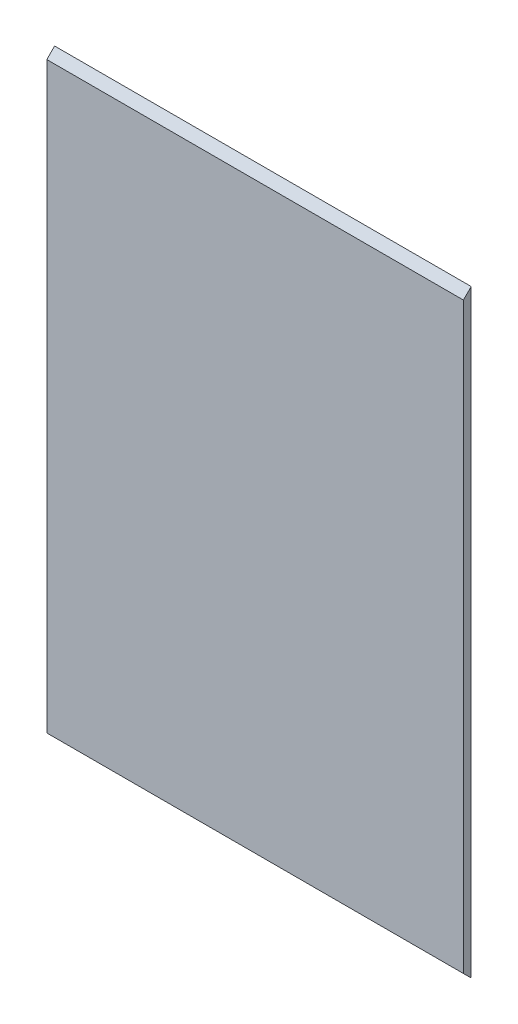
ISO-10303-21;
HEADER;
FILE_DESCRIPTION(('STEP AP214'),'2;1');
FILE_NAME('part.step','',(''),(''),'','','');
FILE_SCHEMA(('AUTOMOTIVE_DESIGN { 1 0 10303 214 1 1 1 1 }'));
ENDSEC;
DATA;
#1=APPLICATION_CONTEXT('core data for automotive mechanical design processes');
#2=APPLICATION_PROTOCOL_DEFINITION('international standard','automotive_design',2000,#1);
#3=PRODUCT_CONTEXT('',#1,'mechanical');
#4=PRODUCT('Part','Part','',(#3));
#5=PRODUCT_RELATED_PRODUCT_CATEGORY('part','',(#4));
#6=PRODUCT_DEFINITION_FORMATION('','',#4);
#7=PRODUCT_DEFINITION_CONTEXT('part definition',#1,'design');
#8=PRODUCT_DEFINITION('design','',#6,#7);
#9=PRODUCT_DEFINITION_SHAPE('','',#8);
#10=(LENGTH_UNIT() NAMED_UNIT(*) SI_UNIT(.MILLI.,.METRE.));
#11=(NAMED_UNIT(*) PLANE_ANGLE_UNIT() SI_UNIT($,.RADIAN.));
#12=(NAMED_UNIT(*) SI_UNIT($,.STERADIAN.) SOLID_ANGLE_UNIT());
#13=UNCERTAINTY_MEASURE_WITH_UNIT(LENGTH_MEASURE(1.E-05),#10,'distance_accuracy_value','');
#14=(GEOMETRIC_REPRESENTATION_CONTEXT(3) GLOBAL_UNCERTAINTY_ASSIGNED_CONTEXT((#13)) GLOBAL_UNIT_ASSIGNED_CONTEXT((#10,
#11,#12)) REPRESENTATION_CONTEXT('',''));
#15=CARTESIAN_POINT('',(0.,0.,0.));
#16=DIRECTION('',(0.,0.,1.));
#17=DIRECTION('',(1.,0.,0.));
#18=AXIS2_PLACEMENT_3D('',#15,#16,#17);
#19=CARTESIAN_POINT('',(-0.8,0.,0.635));
#20=DIRECTION('',(-1.,0.,0.));
#21=DIRECTION('',(0.,0.,1.));
#22=AXIS2_PLACEMENT_3D('',#19,#20,#21);
#23=PLANE('',#22);
#24=DIRECTION('',(0.,0.707106781186548,0.707106781186548));
#25=VECTOR('',#24,1.);
#26=CARTESIAN_POINT('',(-0.8,-1.12,0.65));
#27=LINE('',#26,#25);
#28=CARTESIAN_POINT('',(-0.8,-1.15,0.62));
#29=VERTEX_POINT('',#28);
#30=CARTESIAN_POINT('',(-0.8,-1.12,0.65));
#31=VERTEX_POINT('',#30);
#32=EDGE_CURVE('E11',#29,#31,#27,.T.);
#33=ORIENTED_EDGE('',*,*,#32,.T.);
#34=DIRECTION('',(0.,1.,0.));
#35=VECTOR('',#34,1.);
#36=CARTESIAN_POINT('',(-0.8,1.12,0.65));
#37=LINE('',#36,#35);
#38=CARTESIAN_POINT('',(-0.8,1.12,0.65));
#39=VERTEX_POINT('',#38);
#40=EDGE_CURVE('E101',#31,#39,#37,.T.);
#41=ORIENTED_EDGE('',*,*,#40,.T.);
#42=DIRECTION('',(0.,0.707106781186548,-0.707106781186548));
#43=VECTOR('',#42,1.);
#44=CARTESIAN_POINT('',(-0.8,1.15,0.62));
#45=LINE('',#44,#43);
#46=CARTESIAN_POINT('',(-0.8,1.15,0.62));
#47=VERTEX_POINT('',#46);
#48=EDGE_CURVE('E79',#39,#47,#45,.T.);
#49=ORIENTED_EDGE('',*,*,#48,.T.);
#50=DIRECTION('',(0.,-1.,0.));
#51=VECTOR('',#50,1.);
#52=CARTESIAN_POINT('',(-0.8,-1.15,0.62));
#53=LINE('',#52,#51);
#54=EDGE_CURVE('E86',#47,#29,#53,.T.);
#55=ORIENTED_EDGE('',*,*,#54,.T.);
#56=EDGE_LOOP('',(#33,#41,#49,#55));
#57=FACE_BOUND('',#56,.T.);
#58=ADVANCED_FACE('F16',(#57),#23,.T.);
#59=CARTESIAN_POINT('',(0.8,0.,0.635));
#60=DIRECTION('',(1.,0.,0.));
#61=DIRECTION('',(0.,1.,0.));
#62=AXIS2_PLACEMENT_3D('',#59,#60,#61);
#63=PLANE('',#62);
#64=DIRECTION('',(0.,-0.707106781186548,-0.707106781186548));
#65=VECTOR('',#64,1.);
#66=CARTESIAN_POINT('',(0.8,-1.12,0.65));
#67=LINE('',#66,#65);
#68=CARTESIAN_POINT('',(0.8,-1.12,0.65));
#69=VERTEX_POINT('',#68);
#70=CARTESIAN_POINT('',(0.8,-1.15,0.62));
#71=VERTEX_POINT('',#70);
#72=EDGE_CURVE('E27',#69,#71,#67,.T.);
#73=ORIENTED_EDGE('',*,*,#72,.T.);
#74=DIRECTION('',(0.,1.,0.));
#75=VECTOR('',#74,1.);
#76=CARTESIAN_POINT('',(0.8,-1.15,0.62));
#77=LINE('',#76,#75);
#78=CARTESIAN_POINT('',(0.8,1.15,0.62));
#79=VERTEX_POINT('',#78);
#80=EDGE_CURVE('E85',#71,#79,#77,.T.);
#81=ORIENTED_EDGE('',*,*,#80,.T.);
#82=DIRECTION('',(0.,-0.707106781186548,0.707106781186548));
#83=VECTOR('',#82,1.);
#84=CARTESIAN_POINT('',(0.8,1.15,0.62));
#85=LINE('',#84,#83);
#86=CARTESIAN_POINT('',(0.8,1.12,0.65));
#87=VERTEX_POINT('',#86);
#88=EDGE_CURVE('E67',#79,#87,#85,.T.);
#89=ORIENTED_EDGE('',*,*,#88,.T.);
#90=DIRECTION('',(0.,-1.,0.));
#91=VECTOR('',#90,1.);
#92=CARTESIAN_POINT('',(0.8,1.12,0.65));
#93=LINE('',#92,#91);
#94=EDGE_CURVE('E20',#87,#69,#93,.T.);
#95=ORIENTED_EDGE('',*,*,#94,.T.);
#96=EDGE_LOOP('',(#73,#81,#89,#95));
#97=FACE_BOUND('',#96,.T.);
#98=ADVANCED_FACE('F89',(#97),#63,.T.);
#99=CARTESIAN_POINT('',(0.8,-1.15,0.62));
#100=DIRECTION('',(0.,-0.707106781186548,0.707106781186548));
#101=DIRECTION('',(-1.,0.,0.));
#102=AXIS2_PLACEMENT_3D('',#99,#100,#101);
#103=PLANE('',#102);
#104=ORIENTED_EDGE('',*,*,#72,.F.);
#105=DIRECTION('',(-1.,0.,0.));
#106=VECTOR('',#105,1.);
#107=CARTESIAN_POINT('',(0.8,-1.12,0.65));
#108=LINE('',#107,#106);
#109=EDGE_CURVE('E99',#69,#31,#108,.T.);
#110=ORIENTED_EDGE('',*,*,#109,.T.);
#111=ORIENTED_EDGE('',*,*,#32,.F.);
#112=DIRECTION('',(-1.,0.,0.));
#113=VECTOR('',#112,1.);
#114=CARTESIAN_POINT('',(0.8,-1.15,0.62));
#115=LINE('',#114,#113);
#116=EDGE_CURVE('E92',#71,#29,#115,.T.);
#117=ORIENTED_EDGE('',*,*,#116,.F.);
#118=EDGE_LOOP('',(#104,#110,#111,#117));
#119=FACE_BOUND('',#118,.T.);
#120=ADVANCED_FACE('F121',(#119),#103,.T.);
#121=CARTESIAN_POINT('',(0.8,-1.12,0.65));
#122=DIRECTION('',(0.,0.,1.));
#123=DIRECTION('',(1.,0.,0.));
#124=AXIS2_PLACEMENT_3D('',#121,#122,#123);
#125=PLANE('',#124);
#126=ORIENTED_EDGE('',*,*,#94,.F.);
#127=DIRECTION('',(-1.,0.,0.));
#128=VECTOR('',#127,1.);
#129=CARTESIAN_POINT('',(0.8,1.12,0.65));
#130=LINE('',#129,#128);
#131=EDGE_CURVE('E74',#87,#39,#130,.T.);
#132=ORIENTED_EDGE('',*,*,#131,.T.);
#133=ORIENTED_EDGE('',*,*,#40,.F.);
#134=ORIENTED_EDGE('',*,*,#109,.F.);
#135=EDGE_LOOP('',(#126,#132,#133,#134));
#136=FACE_BOUND('',#135,.T.);
#137=ADVANCED_FACE('F18',(#136),#125,.T.);
#138=CARTESIAN_POINT('',(0.8,1.12,0.65));
#139=DIRECTION('',(0.,0.707106781186548,0.707106781186548));
#140=DIRECTION('',(1.,0.,0.));
#141=AXIS2_PLACEMENT_3D('',#138,#139,#140);
#142=PLANE('',#141);
#143=ORIENTED_EDGE('',*,*,#88,.F.);
#144=DIRECTION('',(-1.,0.,0.));
#145=VECTOR('',#144,1.);
#146=CARTESIAN_POINT('',(0.8,1.15,0.62));
#147=LINE('',#146,#145);
#148=EDGE_CURVE('E71',#79,#47,#147,.T.);
#149=ORIENTED_EDGE('',*,*,#148,.T.);
#150=ORIENTED_EDGE('',*,*,#48,.F.);
#151=ORIENTED_EDGE('',*,*,#131,.F.);
#152=EDGE_LOOP('',(#143,#149,#150,#151));
#153=FACE_BOUND('',#152,.T.);
#154=ADVANCED_FACE('F69',(#153),#142,.T.);
#155=CARTESIAN_POINT('',(0.8,1.15,0.62));
#156=DIRECTION('',(0.,0.,-1.));
#157=DIRECTION('',(0.,-1.,0.));
#158=AXIS2_PLACEMENT_3D('',#155,#156,#157);
#159=PLANE('',#158);
#160=ORIENTED_EDGE('',*,*,#80,.F.);
#161=ORIENTED_EDGE('',*,*,#116,.T.);
#162=ORIENTED_EDGE('',*,*,#54,.F.);
#163=ORIENTED_EDGE('',*,*,#148,.F.);
#164=EDGE_LOOP('',(#160,#161,#162,#163));
#165=FACE_BOUND('',#164,.T.);
#166=ADVANCED_FACE('F83',(#165),#159,.T.);
#167=CLOSED_SHELL('',(#58,#98,#120,#137,#154,#166));
#168=MANIFOLD_SOLID_BREP('B1',#167);
#169=ADVANCED_BREP_SHAPE_REPRESENTATION('',(#18,#168),#14);
#170=SHAPE_DEFINITION_REPRESENTATION(#9,#169);
ENDSEC;
END-ISO-10303-21;
